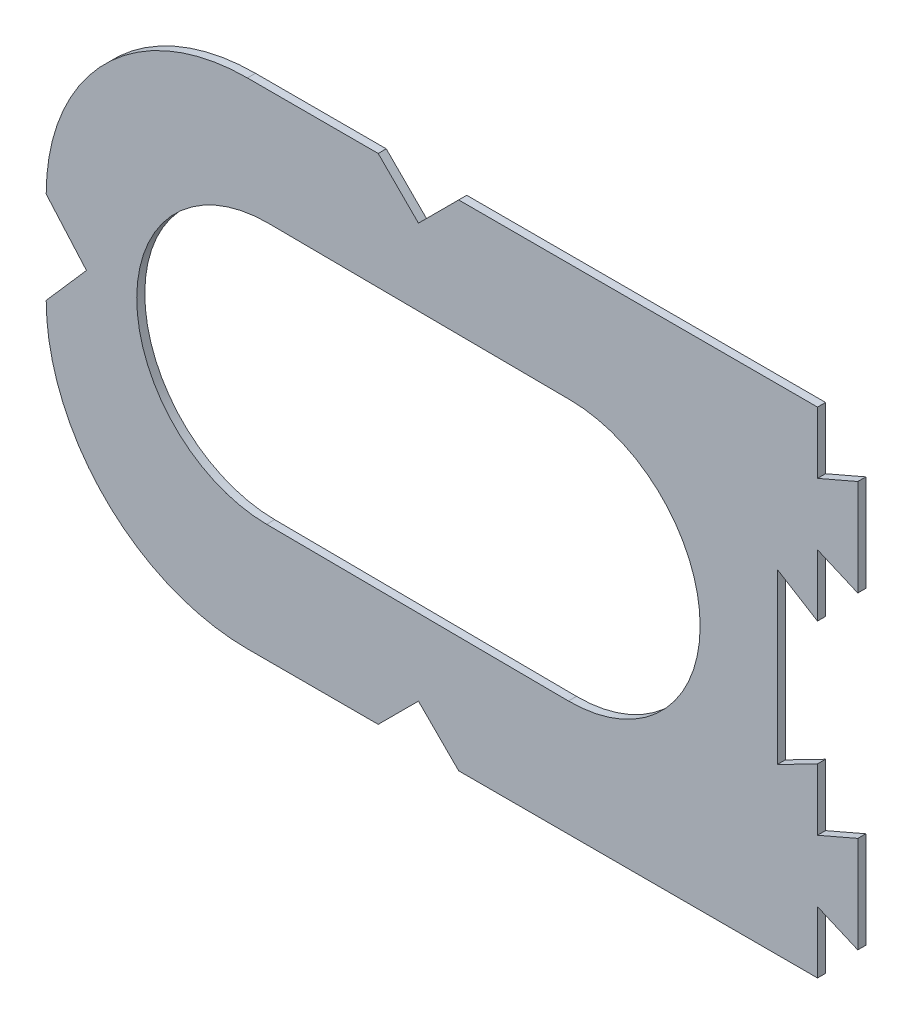
ISO-10303-21;
HEADER;
FILE_DESCRIPTION(('STEP AP214'),'2;1');
FILE_NAME('part.step','',(''),(''),'','','');
FILE_SCHEMA(('AUTOMOTIVE_DESIGN { 1 0 10303 214 1 1 1 1 }'));
ENDSEC;
DATA;
#1=APPLICATION_CONTEXT('core data for automotive mechanical design processes');
#2=APPLICATION_PROTOCOL_DEFINITION('international standard','automotive_design',2000,#1);
#3=PRODUCT_CONTEXT('',#1,'mechanical');
#4=PRODUCT('Part','Part','',(#3));
#5=PRODUCT_RELATED_PRODUCT_CATEGORY('part','',(#4));
#6=PRODUCT_DEFINITION_FORMATION('','',#4);
#7=PRODUCT_DEFINITION_CONTEXT('part definition',#1,'design');
#8=PRODUCT_DEFINITION('design','',#6,#7);
#9=PRODUCT_DEFINITION_SHAPE('','',#8);
#10=(LENGTH_UNIT() NAMED_UNIT(*) SI_UNIT(.MILLI.,.METRE.));
#11=(NAMED_UNIT(*) PLANE_ANGLE_UNIT() SI_UNIT($,.RADIAN.));
#12=(NAMED_UNIT(*) SI_UNIT($,.STERADIAN.) SOLID_ANGLE_UNIT());
#13=UNCERTAINTY_MEASURE_WITH_UNIT(LENGTH_MEASURE(1.E-05),#10,'distance_accuracy_value','');
#14=(GEOMETRIC_REPRESENTATION_CONTEXT(3) GLOBAL_UNCERTAINTY_ASSIGNED_CONTEXT((#13)) GLOBAL_UNIT_ASSIGNED_CONTEXT((#10,
#11,#12)) REPRESENTATION_CONTEXT('',''));
#15=CARTESIAN_POINT('',(0.,0.,0.));
#16=DIRECTION('',(0.,0.,1.));
#17=DIRECTION('',(1.,0.,0.));
#18=AXIS2_PLACEMENT_3D('',#15,#16,#17);
#19=CARTESIAN_POINT('',(0.,61.4294618882521,2.));
#20=DIRECTION('',(0.,-1.,0.));
#21=DIRECTION('',(1.,0.,0.));
#22=AXIS2_PLACEMENT_3D('',#19,#20,#21);
#23=PLANE('',#22);
#24=DIRECTION('',(-1.,0.,0.));
#25=VECTOR('',#24,1.);
#26=CARTESIAN_POINT('',(0.,61.4294618882521,0.));
#27=LINE('',#26,#25);
#28=CARTESIAN_POINT('',(-10.0000000000001,61.4294618882521,0.));
#29=VERTEX_POINT('',#28);
#30=CARTESIAN_POINT('',(-42.4977984899537,61.4294618882521,0.));
#31=VERTEX_POINT('',#30);
#32=EDGE_CURVE('E277',#29,#31,#27,.T.);
#33=ORIENTED_EDGE('',*,*,#32,.T.);
#34=DIRECTION('',(0.,0.,-1.));
#35=VECTOR('',#34,1.);
#36=CARTESIAN_POINT('',(-42.4977984899537,61.4294618882521,2.));
#37=LINE('',#36,#35);
#38=CARTESIAN_POINT('',(-42.4977984899537,61.4294618882521,2.));
#39=VERTEX_POINT('',#38);
#40=EDGE_CURVE('E11',#39,#31,#37,.T.);
#41=ORIENTED_EDGE('',*,*,#40,.F.);
#42=DIRECTION('',(-1.,0.,0.));
#43=VECTOR('',#42,1.);
#44=CARTESIAN_POINT('',(0.,61.4294618882521,2.));
#45=LINE('',#44,#43);
#46=CARTESIAN_POINT('',(-10.0000000000001,61.4294618882521,2.));
#47=VERTEX_POINT('',#46);
#48=EDGE_CURVE('E417',#47,#39,#45,.T.);
#49=ORIENTED_EDGE('',*,*,#48,.F.);
#50=DIRECTION('',(0.,0.,-1.));
#51=VECTOR('',#50,1.);
#52=CARTESIAN_POINT('',(-10.0000000000001,61.4294618882521,2.));
#53=LINE('',#52,#51);
#54=EDGE_CURVE('E344',#47,#29,#53,.T.);
#55=ORIENTED_EDGE('',*,*,#54,.T.);
#56=EDGE_LOOP('',(#33,#41,#49,#55));
#57=FACE_BOUND('',#56,.T.);
#58=ADVANCED_FACE('F41',(#57),#23,.F.);
#59=CARTESIAN_POINT('',(-42.4977984899541,11.4294618882521,2.));
#60=DIRECTION('',(0.,0.,-1.));
#61=DIRECTION('',(-1.,0.,0.));
#62=AXIS2_PLACEMENT_3D('',#59,#60,#61);
#63=CYLINDRICAL_SURFACE('',#62,50.);
#64=CARTESIAN_POINT('',(-42.4977984899541,11.4294618882521,0.));
#65=DIRECTION('',(0.,0.,1.));
#66=DIRECTION('',(1.,0.,0.));
#67=AXIS2_PLACEMENT_3D('',#64,#65,#66);
#68=CIRCLE('',#67,50.);
#69=CARTESIAN_POINT('',(-92.4977984899541,11.4294618882518,0.));
#70=VERTEX_POINT('',#69);
#71=EDGE_CURVE('E282',#31,#70,#68,.T.);
#72=ORIENTED_EDGE('',*,*,#71,.T.);
#73=DIRECTION('',(0.,0.,-1.));
#74=VECTOR('',#73,1.);
#75=CARTESIAN_POINT('',(-92.4977984899541,11.4294618882518,2.));
#76=LINE('',#75,#74);
#77=CARTESIAN_POINT('',(-92.4977984899541,11.4294618882518,2.));
#78=VERTEX_POINT('',#77);
#79=EDGE_CURVE('E51',#78,#70,#76,.T.);
#80=ORIENTED_EDGE('',*,*,#79,.F.);
#81=CARTESIAN_POINT('',(-42.4977984899541,11.4294618882521,2.));
#82=DIRECTION('',(0.,0.,1.));
#83=DIRECTION('',(1.,0.,0.));
#84=AXIS2_PLACEMENT_3D('',#81,#82,#83);
#85=CIRCLE('',#84,50.);
#86=EDGE_CURVE('E424',#39,#78,#85,.T.);
#87=ORIENTED_EDGE('',*,*,#86,.F.);
#88=ORIENTED_EDGE('',*,*,#40,.T.);
#89=EDGE_LOOP('',(#72,#80,#87,#88));
#90=FACE_BOUND('',#89,.T.);
#91=ADVANCED_FACE('F500',(#90),#63,.T.);
#92=CARTESIAN_POINT('',(-46.7275739735661,-40.8834417844265,2.));
#93=DIRECTION('',(-0.752602119765757,-0.658475549526396,0.));
#94=DIRECTION('',(0.658475549526396,-0.752602119765757,0.));
#95=AXIS2_PLACEMENT_3D('',#92,#93,#94);
#96=PLANE('',#95);
#97=DIRECTION('',(-0.658475549526396,0.752602119765757,0.));
#98=VECTOR('',#97,1.);
#99=CARTESIAN_POINT('',(-46.7275739735661,-40.8834417844265,0.));
#100=LINE('',#99,#98);
#101=CARTESIAN_POINT('',(-82.4977984899541,0.,0.));
#102=VERTEX_POINT('',#101);
#103=EDGE_CURVE('E281',#102,#70,#100,.T.);
#104=ORIENTED_EDGE('',*,*,#103,.F.);
#105=DIRECTION('',(0.,0.,-1.));
#106=VECTOR('',#105,1.);
#107=CARTESIAN_POINT('',(-82.4977984899541,0.,2.));
#108=LINE('',#107,#106);
#109=CARTESIAN_POINT('',(-82.4977984899541,0.,2.));
#110=VERTEX_POINT('',#109);
#111=EDGE_CURVE('E389',#110,#102,#108,.T.);
#112=ORIENTED_EDGE('',*,*,#111,.F.);
#113=DIRECTION('',(-0.658475549526396,0.752602119765757,0.));
#114=VECTOR('',#113,1.);
#115=CARTESIAN_POINT('',(-46.7275739735661,-40.8834417844265,2.));
#116=LINE('',#115,#114);
#117=EDGE_CURVE('E425',#110,#78,#116,.T.);
#118=ORIENTED_EDGE('',*,*,#117,.T.);
#119=ORIENTED_EDGE('',*,*,#79,.T.);
#120=EDGE_LOOP('',(#104,#112,#118,#119));
#121=FACE_BOUND('',#120,.T.);
#122=ADVANCED_FACE('F502',(#121),#96,.T.);
#123=CARTESIAN_POINT('',(-46.7275739735661,40.8834417844265,2.));
#124=DIRECTION('',(-0.752602119765757,0.658475549526396,0.));
#125=DIRECTION('',(-0.658475549526396,-0.752602119765757,0.));
#126=AXIS2_PLACEMENT_3D('',#123,#124,#125);
#127=PLANE('',#126);
#128=DIRECTION('',(0.658475549526396,0.752602119765757,0.));
#129=VECTOR('',#128,1.);
#130=CARTESIAN_POINT('',(-46.7275739735661,40.8834417844265,0.));
#131=LINE('',#130,#129);
#132=CARTESIAN_POINT('',(-92.4977984899541,-11.4294618882517,0.));
#133=VERTEX_POINT('',#132);
#134=EDGE_CURVE('E287',#133,#102,#131,.T.);
#135=ORIENTED_EDGE('',*,*,#134,.F.);
#136=DIRECTION('',(0.,0.,-1.));
#137=VECTOR('',#136,1.);
#138=CARTESIAN_POINT('',(-92.4977984899541,-11.4294618882517,2.));
#139=LINE('',#138,#137);
#140=CARTESIAN_POINT('',(-92.4977984899541,-11.4294618882517,2.));
#141=VERTEX_POINT('',#140);
#142=EDGE_CURVE('E386',#141,#133,#139,.T.);
#143=ORIENTED_EDGE('',*,*,#142,.F.);
#144=DIRECTION('',(0.658475549526396,0.752602119765757,0.));
#145=VECTOR('',#144,1.);
#146=CARTESIAN_POINT('',(-46.7275739735661,40.8834417844265,2.));
#147=LINE('',#146,#145);
#148=EDGE_CURVE('E426',#141,#110,#147,.T.);
#149=ORIENTED_EDGE('',*,*,#148,.T.);
#150=ORIENTED_EDGE('',*,*,#111,.T.);
#151=EDGE_LOOP('',(#135,#143,#149,#150));
#152=FACE_BOUND('',#151,.T.);
#153=ADVANCED_FACE('F591',(#152),#127,.T.);
#154=CARTESIAN_POINT('',(-42.4977984899541,-11.4294618882521,2.));
#155=DIRECTION('',(0.,0.,-1.));
#156=DIRECTION('',(-1.,0.,0.));
#157=AXIS2_PLACEMENT_3D('',#154,#155,#156);
#158=CYLINDRICAL_SURFACE('',#157,50.);
#159=CARTESIAN_POINT('',(-42.4977984899541,-11.4294618882521,0.));
#160=DIRECTION('',(0.,0.,1.));
#161=DIRECTION('',(1.,0.,0.));
#162=AXIS2_PLACEMENT_3D('',#159,#160,#161);
#163=CIRCLE('',#162,50.);
#164=CARTESIAN_POINT('',(-42.4977984899537,-61.4294618882521,0.));
#165=VERTEX_POINT('',#164);
#166=EDGE_CURVE('E290',#133,#165,#163,.T.);
#167=ORIENTED_EDGE('',*,*,#166,.T.);
#168=DIRECTION('',(0.,0.,-1.));
#169=VECTOR('',#168,1.);
#170=CARTESIAN_POINT('',(-42.4977984899537,-61.4294618882521,2.));
#171=LINE('',#170,#169);
#172=CARTESIAN_POINT('',(-42.4977984899537,-61.4294618882521,2.));
#173=VERTEX_POINT('',#172);
#174=EDGE_CURVE('E384',#173,#165,#171,.T.);
#175=ORIENTED_EDGE('',*,*,#174,.F.);
#176=CARTESIAN_POINT('',(-42.4977984899541,-11.4294618882521,2.));
#177=DIRECTION('',(0.,0.,1.));
#178=DIRECTION('',(1.,0.,0.));
#179=AXIS2_PLACEMENT_3D('',#176,#177,#178);
#180=CIRCLE('',#179,50.);
#181=EDGE_CURVE('E431',#141,#173,#180,.T.);
#182=ORIENTED_EDGE('',*,*,#181,.F.);
#183=ORIENTED_EDGE('',*,*,#142,.T.);
#184=EDGE_LOOP('',(#167,#175,#182,#183));
#185=FACE_BOUND('',#184,.T.);
#186=ADVANCED_FACE('F590',(#185),#158,.T.);
#187=CARTESIAN_POINT('',(0.,-61.4294618882521,2.));
#188=DIRECTION('',(0.,-1.,0.));
#189=DIRECTION('',(0.,0.,-1.));
#190=AXIS2_PLACEMENT_3D('',#187,#188,#189);
#191=PLANE('',#190);
#192=DIRECTION('',(-1.,0.,0.));
#193=VECTOR('',#192,1.);
#194=CARTESIAN_POINT('',(0.,-61.4294618882521,0.));
#195=LINE('',#194,#193);
#196=CARTESIAN_POINT('',(-9.99999999999979,-61.4294618882521,0.));
#197=VERTEX_POINT('',#196);
#198=EDGE_CURVE('E291',#197,#165,#195,.T.);
#199=ORIENTED_EDGE('',*,*,#198,.F.);
#200=DIRECTION('',(0.,0.,-1.));
#201=VECTOR('',#200,1.);
#202=CARTESIAN_POINT('',(-9.99999999999979,-61.4294618882521,2.));
#203=LINE('',#202,#201);
#204=CARTESIAN_POINT('',(-9.99999999999979,-61.4294618882521,2.));
#205=VERTEX_POINT('',#204);
#206=EDGE_CURVE('E385',#205,#197,#203,.T.);
#207=ORIENTED_EDGE('',*,*,#206,.F.);
#208=DIRECTION('',(-1.,0.,0.));
#209=VECTOR('',#208,1.);
#210=CARTESIAN_POINT('',(0.,-61.4294618882521,2.));
#211=LINE('',#210,#209);
#212=EDGE_CURVE('E434',#205,#173,#211,.T.);
#213=ORIENTED_EDGE('',*,*,#212,.T.);
#214=ORIENTED_EDGE('',*,*,#174,.T.);
#215=EDGE_LOOP('',(#199,#207,#213,#214));
#216=FACE_BOUND('',#215,.T.);
#217=ADVANCED_FACE('F583',(#216),#191,.T.);
#218=CARTESIAN_POINT('',(25.714730944126,-25.7147309441254,2.));
#219=DIRECTION('',(0.707106781186557,-0.707106781186539,0.));
#220=DIRECTION('',(0.707106781186539,0.707106781186557,0.));
#221=AXIS2_PLACEMENT_3D('',#218,#219,#220);
#222=PLANE('',#221);
#223=DIRECTION('',(-0.707106781186539,-0.707106781186556,0.));
#224=VECTOR('',#223,1.);
#225=CARTESIAN_POINT('',(25.714730944126,-25.7147309441254,0.));
#226=LINE('',#225,#224);
#227=CARTESIAN_POINT('',(0.,-51.4294618882521,0.));
#228=VERTEX_POINT('',#227);
#229=EDGE_CURVE('E296',#228,#197,#226,.T.);
#230=ORIENTED_EDGE('',*,*,#229,.F.);
#231=DIRECTION('',(0.,0.,-1.));
#232=VECTOR('',#231,1.);
#233=CARTESIAN_POINT('',(0.,-51.4294618882521,2.));
#234=LINE('',#233,#232);
#235=CARTESIAN_POINT('',(0.,-51.4294618882521,2.));
#236=VERTEX_POINT('',#235);
#237=EDGE_CURVE('E380',#236,#228,#234,.T.);
#238=ORIENTED_EDGE('',*,*,#237,.F.);
#239=DIRECTION('',(-0.707106781186539,-0.707106781186556,0.));
#240=VECTOR('',#239,1.);
#241=CARTESIAN_POINT('',(25.714730944126,-25.7147309441254,2.));
#242=LINE('',#241,#240);
#243=EDGE_CURVE('E438',#236,#205,#242,.T.);
#244=ORIENTED_EDGE('',*,*,#243,.T.);
#245=ORIENTED_EDGE('',*,*,#206,.T.);
#246=EDGE_LOOP('',(#230,#238,#244,#245));
#247=FACE_BOUND('',#246,.T.);
#248=ADVANCED_FACE('F579',(#247),#222,.T.);
#249=CARTESIAN_POINT('',(-25.7147309441261,-25.7147309441267,2.));
#250=DIRECTION('',(0.707106781186538,0.707106781186557,0.));
#251=DIRECTION('',(-0.707106781186557,0.707106781186538,0.));
#252=AXIS2_PLACEMENT_3D('',#249,#250,#251);
#253=PLANE('',#252);
#254=DIRECTION('',(0.707106781186557,-0.707106781186538,0.));
#255=VECTOR('',#254,1.);
#256=CARTESIAN_POINT('',(-25.7147309441261,-25.7147309441267,0.));
#257=LINE('',#256,#255);
#258=CARTESIAN_POINT('',(10.0000000000002,-61.4294618882521,0.));
#259=VERTEX_POINT('',#258);
#260=EDGE_CURVE('E298',#228,#259,#257,.T.);
#261=ORIENTED_EDGE('',*,*,#260,.T.);
#262=DIRECTION('',(0.,0.,-1.));
#263=VECTOR('',#262,1.);
#264=CARTESIAN_POINT('',(10.0000000000002,-61.4294618882521,2.));
#265=LINE('',#264,#263);
#266=CARTESIAN_POINT('',(10.0000000000002,-61.4294618882521,2.));
#267=VERTEX_POINT('',#266);
#268=EDGE_CURVE('E379',#267,#259,#265,.T.);
#269=ORIENTED_EDGE('',*,*,#268,.F.);
#270=DIRECTION('',(0.707106781186557,-0.707106781186538,0.));
#271=VECTOR('',#270,1.);
#272=CARTESIAN_POINT('',(-25.7147309441261,-25.7147309441267,2.));
#273=LINE('',#272,#271);
#274=EDGE_CURVE('E440',#236,#267,#273,.T.);
#275=ORIENTED_EDGE('',*,*,#274,.F.);
#276=ORIENTED_EDGE('',*,*,#237,.T.);
#277=EDGE_LOOP('',(#261,#269,#275,#276));
#278=FACE_BOUND('',#277,.T.);
#279=ADVANCED_FACE('F574',(#278),#253,.F.);
#280=CARTESIAN_POINT('',(0.,-61.4294618882521,2.));
#281=DIRECTION('',(0.,-1.,0.));
#282=DIRECTION('',(0.,0.,-1.));
#283=AXIS2_PLACEMENT_3D('',#280,#281,#282);
#284=PLANE('',#283);
#285=DIRECTION('',(-1.,0.,0.));
#286=VECTOR('',#285,1.);
#287=CARTESIAN_POINT('',(0.,-61.4294618882521,0.));
#288=LINE('',#287,#286);
#289=CARTESIAN_POINT('',(99.1612144125211,-61.4294618882521,0.));
#290=VERTEX_POINT('',#289);
#291=EDGE_CURVE('E302',#290,#259,#288,.T.);
#292=ORIENTED_EDGE('',*,*,#291,.F.);
#293=DIRECTION('',(0.,0.,-1.));
#294=VECTOR('',#293,1.);
#295=CARTESIAN_POINT('',(99.1612144125211,-61.4294618882521,2.));
#296=LINE('',#295,#294);
#297=CARTESIAN_POINT('',(99.1612144125211,-61.4294618882521,2.));
#298=VERTEX_POINT('',#297);
#299=EDGE_CURVE('E376',#298,#290,#296,.T.);
#300=ORIENTED_EDGE('',*,*,#299,.F.);
#301=DIRECTION('',(-1.,0.,0.));
#302=VECTOR('',#301,1.);
#303=CARTESIAN_POINT('',(0.,-61.4294618882521,2.));
#304=LINE('',#303,#302);
#305=EDGE_CURVE('E443',#298,#267,#304,.T.);
#306=ORIENTED_EDGE('',*,*,#305,.T.);
#307=ORIENTED_EDGE('',*,*,#268,.T.);
#308=EDGE_LOOP('',(#292,#300,#306,#307));
#309=FACE_BOUND('',#308,.T.);
#310=ADVANCED_FACE('F573',(#309),#284,.T.);
#311=CARTESIAN_POINT('',(99.1612144125209,3.5836934697452E-13,2.));
#312=DIRECTION('',(-1.,0.,0.));
#313=DIRECTION('',(0.,-1.,0.));
#314=AXIS2_PLACEMENT_3D('',#311,#312,#313);
#315=PLANE('',#314);
#316=DIRECTION('',(0.,1.,0.));
#317=VECTOR('',#316,1.);
#318=CARTESIAN_POINT('',(99.1612144125209,3.5836934697452E-13,0.));
#319=LINE('',#318,#317);
#320=CARTESIAN_POINT('',(99.1612144125211,-46.0694618882521,0.));
#321=VERTEX_POINT('',#320);
#322=EDGE_CURVE('E304',#290,#321,#319,.T.);
#323=ORIENTED_EDGE('',*,*,#322,.T.);
#324=DIRECTION('',(0.,0.,-1.));
#325=VECTOR('',#324,1.);
#326=CARTESIAN_POINT('',(99.1612144125211,-46.0694618882521,2.));
#327=LINE('',#326,#325);
#328=CARTESIAN_POINT('',(99.1612144125211,-46.0694618882521,2.));
#329=VERTEX_POINT('',#328);
#330=EDGE_CURVE('E374',#329,#321,#327,.T.);
#331=ORIENTED_EDGE('',*,*,#330,.F.);
#332=DIRECTION('',(0.,1.,0.));
#333=VECTOR('',#332,1.);
#334=CARTESIAN_POINT('',(99.1612144125209,3.5836934697452E-13,2.));
#335=LINE('',#334,#333);
#336=EDGE_CURVE('E444',#298,#329,#335,.T.);
#337=ORIENTED_EDGE('',*,*,#336,.F.);
#338=ORIENTED_EDGE('',*,*,#299,.T.);
#339=EDGE_LOOP('',(#323,#331,#337,#338));
#340=FACE_BOUND('',#339,.T.);
#341=ADVANCED_FACE('F567',(#340),#315,.F.);
#342=CARTESIAN_POINT('',(-1.17656903720344,-2.7235394379709,2.));
#343=DIRECTION('',(0.396576689295303,0.918001595590975,0.));
#344=DIRECTION('',(-0.918001595590975,0.396576689295303,0.));
#345=AXIS2_PLACEMENT_3D('',#342,#343,#344);
#346=PLANE('',#345);
#347=DIRECTION('',(0.918001595590975,-0.396576689295303,0.));
#348=VECTOR('',#347,1.);
#349=CARTESIAN_POINT('',(-1.17656903720344,-2.7235394379709,0.));
#350=LINE('',#349,#348);
#351=CARTESIAN_POINT('',(109.161214412521,-50.3894618882521,0.));
#352=VERTEX_POINT('',#351);
#353=EDGE_CURVE('E310',#321,#352,#350,.T.);
#354=ORIENTED_EDGE('',*,*,#353,.T.);
#355=DIRECTION('',(0.,0.,-1.));
#356=VECTOR('',#355,1.);
#357=CARTESIAN_POINT('',(109.161214412521,-50.3894618882521,2.));
#358=LINE('',#357,#356);
#359=CARTESIAN_POINT('',(109.161214412521,-50.3894618882521,2.));
#360=VERTEX_POINT('',#359);
#361=EDGE_CURVE('E372',#360,#352,#358,.T.);
#362=ORIENTED_EDGE('',*,*,#361,.F.);
#363=DIRECTION('',(0.918001595590975,-0.396576689295303,0.));
#364=VECTOR('',#363,1.);
#365=CARTESIAN_POINT('',(-1.17656903720344,-2.7235394379709,2.));
#366=LINE('',#365,#364);
#367=EDGE_CURVE('E446',#329,#360,#366,.T.);
#368=ORIENTED_EDGE('',*,*,#367,.F.);
#369=ORIENTED_EDGE('',*,*,#330,.T.);
#370=EDGE_LOOP('',(#354,#362,#368,#369));
#371=FACE_BOUND('',#370,.T.);
#372=ADVANCED_FACE('F561',(#371),#346,.F.);
#373=CARTESIAN_POINT('',(109.161214412521,0.,2.));
#374=DIRECTION('',(1.,0.,0.));
#375=DIRECTION('',(0.,1.,0.));
#376=AXIS2_PLACEMENT_3D('',#373,#374,#375);
#377=PLANE('',#376);
#378=DIRECTION('',(0.,-1.,0.));
#379=VECTOR('',#378,1.);
#380=CARTESIAN_POINT('',(109.161214412521,0.,0.));
#381=LINE('',#380,#379);
#382=CARTESIAN_POINT('',(109.161214412521,-26.3894618882521,0.));
#383=VERTEX_POINT('',#382);
#384=EDGE_CURVE('E307',#383,#352,#381,.T.);
#385=ORIENTED_EDGE('',*,*,#384,.F.);
#386=DIRECTION('',(0.,0.,-1.));
#387=VECTOR('',#386,1.);
#388=CARTESIAN_POINT('',(109.161214412521,-26.3894618882521,2.));
#389=LINE('',#388,#387);
#390=CARTESIAN_POINT('',(109.161214412521,-26.3894618882521,2.));
#391=VERTEX_POINT('',#390);
#392=EDGE_CURVE('E368',#391,#383,#389,.T.);
#393=ORIENTED_EDGE('',*,*,#392,.F.);
#394=DIRECTION('',(0.,-1.,0.));
#395=VECTOR('',#394,1.);
#396=CARTESIAN_POINT('',(109.161214412521,0.,2.));
#397=LINE('',#396,#395);
#398=EDGE_CURVE('E448',#391,#360,#397,.T.);
#399=ORIENTED_EDGE('',*,*,#398,.T.);
#400=ORIENTED_EDGE('',*,*,#361,.T.);
#401=EDGE_LOOP('',(#385,#393,#399,#400));
#402=FACE_BOUND('',#401,.T.);
#403=ADVANCED_FACE('F558',(#402),#377,.T.);
#404=CARTESIAN_POINT('',(26.7754149707466,-61.9801272470986,2.));
#405=DIRECTION('',(0.396576689295302,-0.918001595590976,0.));
#406=DIRECTION('',(0.918001595590976,0.396576689295302,0.));
#407=AXIS2_PLACEMENT_3D('',#404,#405,#406);
#408=PLANE('',#407);
#409=DIRECTION('',(-0.918001595590976,-0.396576689295302,0.));
#410=VECTOR('',#409,1.);
#411=CARTESIAN_POINT('',(26.7754149707466,-61.9801272470986,0.));
#412=LINE('',#411,#410);
#413=CARTESIAN_POINT('',(99.161214412521,-30.7094618882521,0.));
#414=VERTEX_POINT('',#413);
#415=EDGE_CURVE('E313',#383,#414,#412,.T.);
#416=ORIENTED_EDGE('',*,*,#415,.T.);
#417=DIRECTION('',(0.,0.,-1.));
#418=VECTOR('',#417,1.);
#419=CARTESIAN_POINT('',(99.161214412521,-30.7094618882521,2.));
#420=LINE('',#419,#418);
#421=CARTESIAN_POINT('',(99.161214412521,-30.7094618882521,2.));
#422=VERTEX_POINT('',#421);
#423=EDGE_CURVE('E366',#422,#414,#420,.T.);
#424=ORIENTED_EDGE('',*,*,#423,.F.);
#425=DIRECTION('',(-0.918001595590976,-0.396576689295302,0.));
#426=VECTOR('',#425,1.);
#427=CARTESIAN_POINT('',(26.7754149707466,-61.9801272470986,2.));
#428=LINE('',#427,#426);
#429=EDGE_CURVE('E451',#391,#422,#428,.T.);
#430=ORIENTED_EDGE('',*,*,#429,.F.);
#431=ORIENTED_EDGE('',*,*,#392,.T.);
#432=EDGE_LOOP('',(#416,#424,#430,#431));
#433=FACE_BOUND('',#432,.T.);
#434=ADVANCED_FACE('F553',(#433),#408,.F.);
#435=CARTESIAN_POINT('',(99.1612144125209,3.5836934697452E-13,2.));
#436=DIRECTION('',(-1.,0.,0.));
#437=DIRECTION('',(0.,-1.,0.));
#438=AXIS2_PLACEMENT_3D('',#435,#436,#437);
#439=PLANE('',#438);
#440=DIRECTION('',(0.,1.,0.));
#441=VECTOR('',#440,1.);
#442=CARTESIAN_POINT('',(99.1612144125209,3.5836934697452E-13,0.));
#443=LINE('',#442,#441);
#444=CARTESIAN_POINT('',(99.161214412521,-15.3494618882521,0.));
#445=VERTEX_POINT('',#444);
#446=EDGE_CURVE('E314',#414,#445,#443,.T.);
#447=ORIENTED_EDGE('',*,*,#446,.T.);
#448=DIRECTION('',(0.,0.,-1.));
#449=VECTOR('',#448,1.);
#450=CARTESIAN_POINT('',(99.161214412521,-15.3494618882521,2.));
#451=LINE('',#450,#449);
#452=CARTESIAN_POINT('',(99.161214412521,-15.3494618882521,2.));
#453=VERTEX_POINT('',#452);
#454=EDGE_CURVE('E362',#453,#445,#451,.T.);
#455=ORIENTED_EDGE('',*,*,#454,.F.);
#456=DIRECTION('',(0.,1.,0.));
#457=VECTOR('',#456,1.);
#458=CARTESIAN_POINT('',(99.1612144125209,3.5836934697452E-13,2.));
#459=LINE('',#458,#457);
#460=EDGE_CURVE('E453',#422,#453,#459,.T.);
#461=ORIENTED_EDGE('',*,*,#460,.F.);
#462=ORIENTED_EDGE('',*,*,#423,.T.);
#463=EDGE_LOOP('',(#447,#455,#461,#462));
#464=FACE_BOUND('',#463,.T.);
#465=ADVANCED_FACE('F552',(#464),#439,.F.);
#466=CARTESIAN_POINT('',(26.9638723848919,-52.4588956904525,2.));
#467=DIRECTION('',(-0.457147041036414,0.88939113042106,0.));
#468=DIRECTION('',(-0.88939113042106,-0.457147041036414,0.));
#469=AXIS2_PLACEMENT_3D('',#466,#467,#468);
#470=PLANE('',#469);
#471=DIRECTION('',(0.88939113042106,0.457147041036414,0.));
#472=VECTOR('',#471,1.);
#473=CARTESIAN_POINT('',(26.9638723848919,-52.4588956904525,0.));
#474=LINE('',#473,#472);
#475=CARTESIAN_POINT('',(89.161214412521,-20.489461888252,0.));
#476=VERTEX_POINT('',#475);
#477=EDGE_CURVE('E318',#476,#445,#474,.T.);
#478=ORIENTED_EDGE('',*,*,#477,.F.);
#479=DIRECTION('',(0.,0.,-1.));
#480=VECTOR('',#479,1.);
#481=CARTESIAN_POINT('',(89.161214412521,-20.489461888252,2.));
#482=LINE('',#481,#480);
#483=CARTESIAN_POINT('',(89.161214412521,-20.489461888252,2.));
#484=VERTEX_POINT('',#483);
#485=EDGE_CURVE('E365',#484,#476,#482,.T.);
#486=ORIENTED_EDGE('',*,*,#485,.F.);
#487=DIRECTION('',(0.88939113042106,0.457147041036414,0.));
#488=VECTOR('',#487,1.);
#489=CARTESIAN_POINT('',(26.9638723848919,-52.4588956904525,2.));
#490=LINE('',#489,#488);
#491=EDGE_CURVE('E454',#484,#453,#490,.T.);
#492=ORIENTED_EDGE('',*,*,#491,.T.);
#493=ORIENTED_EDGE('',*,*,#454,.T.);
#494=EDGE_LOOP('',(#478,#486,#492,#493));
#495=FACE_BOUND('',#494,.T.);
#496=ADVANCED_FACE('F550',(#495),#470,.T.);
#497=CARTESIAN_POINT('',(89.1612144125209,1.76765773472002E-13,2.));
#498=DIRECTION('',(1.,0.,0.));
#499=DIRECTION('',(0.,1.,0.));
#500=AXIS2_PLACEMENT_3D('',#497,#498,#499);
#501=PLANE('',#500);
#502=DIRECTION('',(0.,-1.,0.));
#503=VECTOR('',#502,1.);
#504=CARTESIAN_POINT('',(89.1612144125209,1.76765773472002E-13,0.));
#505=LINE('',#504,#503);
#506=CARTESIAN_POINT('',(89.1612144125209,21.5105381117479,0.));
#507=VERTEX_POINT('',#506);
#508=EDGE_CURVE('E321',#507,#476,#505,.T.);
#509=ORIENTED_EDGE('',*,*,#508,.F.);
#510=DIRECTION('',(0.,0.,-1.));
#511=VECTOR('',#510,1.);
#512=CARTESIAN_POINT('',(89.1612144125209,21.5105381117479,2.));
#513=LINE('',#512,#511);
#514=CARTESIAN_POINT('',(89.1612144125209,21.5105381117479,2.));
#515=VERTEX_POINT('',#514);
#516=EDGE_CURVE('E359',#515,#507,#513,.T.);
#517=ORIENTED_EDGE('',*,*,#516,.F.);
#518=DIRECTION('',(0.,-1.,0.));
#519=VECTOR('',#518,1.);
#520=CARTESIAN_POINT('',(89.1612144125209,1.76765773472002E-13,2.));
#521=LINE('',#520,#519);
#522=EDGE_CURVE('E457',#515,#484,#521,.T.);
#523=ORIENTED_EDGE('',*,*,#522,.T.);
#524=ORIENTED_EDGE('',*,*,#485,.T.);
#525=EDGE_LOOP('',(#509,#517,#523,#524));
#526=FACE_BOUND('',#525,.T.);
#527=ADVANCED_FACE('F543',(#526),#501,.T.);
#528=CARTESIAN_POINT('',(34.0021986914095,55.3781737645104,2.));
#529=DIRECTION('',(0.523241319031515,0.852184558683247,0.));
#530=DIRECTION('',(-0.852184558683247,0.523241319031515,0.));
#531=AXIS2_PLACEMENT_3D('',#528,#529,#530);
#532=PLANE('',#531);
#533=DIRECTION('',(0.852184558683247,-0.523241319031515,0.));
#534=VECTOR('',#533,1.);
#535=CARTESIAN_POINT('',(34.0021986914095,55.3781737645104,0.));
#536=LINE('',#535,#534);
#537=CARTESIAN_POINT('',(99.1612144125209,15.3705381117479,0.));
#538=VERTEX_POINT('',#537);
#539=EDGE_CURVE('E323',#507,#538,#536,.T.);
#540=ORIENTED_EDGE('',*,*,#539,.T.);
#541=DIRECTION('',(0.,0.,-1.));
#542=VECTOR('',#541,1.);
#543=CARTESIAN_POINT('',(99.1612144125209,15.3705381117479,2.));
#544=LINE('',#543,#542);
#545=CARTESIAN_POINT('',(99.1612144125209,15.3705381117479,2.));
#546=VERTEX_POINT('',#545);
#547=EDGE_CURVE('E360',#546,#538,#544,.T.);
#548=ORIENTED_EDGE('',*,*,#547,.F.);
#549=DIRECTION('',(0.852184558683247,-0.523241319031515,0.));
#550=VECTOR('',#549,1.);
#551=CARTESIAN_POINT('',(34.0021986914095,55.3781737645104,2.));
#552=LINE('',#551,#550);
#553=EDGE_CURVE('E462',#515,#546,#552,.T.);
#554=ORIENTED_EDGE('',*,*,#553,.F.);
#555=ORIENTED_EDGE('',*,*,#516,.T.);
#556=EDGE_LOOP('',(#540,#548,#554,#555));
#557=FACE_BOUND('',#556,.T.);
#558=ADVANCED_FACE('F537',(#557),#532,.F.);
#559=CARTESIAN_POINT('',(99.1612144125209,3.5836934697452E-13,2.));
#560=DIRECTION('',(-1.,0.,0.));
#561=DIRECTION('',(0.,-1.,0.));
#562=AXIS2_PLACEMENT_3D('',#559,#560,#561);
#563=PLANE('',#562);
#564=DIRECTION('',(0.,1.,0.));
#565=VECTOR('',#564,1.);
#566=CARTESIAN_POINT('',(99.1612144125209,3.5836934697452E-13,0.));
#567=LINE('',#566,#565);
#568=CARTESIAN_POINT('',(99.1612144125208,30.7305381117479,0.));
#569=VERTEX_POINT('',#568);
#570=EDGE_CURVE('E327',#538,#569,#567,.T.);
#571=ORIENTED_EDGE('',*,*,#570,.T.);
#572=DIRECTION('',(0.,0.,-1.));
#573=VECTOR('',#572,1.);
#574=CARTESIAN_POINT('',(99.1612144125208,30.7305381117479,2.));
#575=LINE('',#574,#573);
#576=CARTESIAN_POINT('',(99.1612144125208,30.7305381117479,2.));
#577=VERTEX_POINT('',#576);
#578=EDGE_CURVE('E354',#577,#569,#575,.T.);
#579=ORIENTED_EDGE('',*,*,#578,.F.);
#580=DIRECTION('',(0.,1.,0.));
#581=VECTOR('',#580,1.);
#582=CARTESIAN_POINT('',(99.1612144125209,3.5836934697452E-13,2.));
#583=LINE('',#582,#581);
#584=EDGE_CURVE('E464',#546,#577,#583,.T.);
#585=ORIENTED_EDGE('',*,*,#584,.F.);
#586=ORIENTED_EDGE('',*,*,#547,.T.);
#587=EDGE_LOOP('',(#571,#579,#585,#586));
#588=FACE_BOUND('',#587,.T.);
#589=ADVANCED_FACE('F532',(#588),#563,.F.);
#590=CARTESIAN_POINT('',(26.7830879392272,61.9978887482109,2.));
#591=DIRECTION('',(0.396576689295303,0.918001595590975,0.));
#592=DIRECTION('',(-0.918001595590975,0.396576689295303,0.));
#593=AXIS2_PLACEMENT_3D('',#590,#591,#592);
#594=PLANE('',#593);
#595=DIRECTION('',(0.918001595590975,-0.396576689295303,0.));
#596=VECTOR('',#595,1.);
#597=CARTESIAN_POINT('',(26.7830879392272,61.9978887482109,0.));
#598=LINE('',#597,#596);
#599=CARTESIAN_POINT('',(109.161214412521,26.4105381117479,0.));
#600=VERTEX_POINT('',#599);
#601=EDGE_CURVE('E329',#569,#600,#598,.T.);
#602=ORIENTED_EDGE('',*,*,#601,.T.);
#603=DIRECTION('',(0.,0.,-1.));
#604=VECTOR('',#603,1.);
#605=CARTESIAN_POINT('',(109.161214412521,26.4105381117479,2.));
#606=LINE('',#605,#604);
#607=CARTESIAN_POINT('',(109.161214412521,26.4105381117479,2.));
#608=VERTEX_POINT('',#607);
#609=EDGE_CURVE('E355',#608,#600,#606,.T.);
#610=ORIENTED_EDGE('',*,*,#609,.F.);
#611=DIRECTION('',(0.918001595590975,-0.396576689295303,0.));
#612=VECTOR('',#611,1.);
#613=CARTESIAN_POINT('',(26.7830879392272,61.9978887482109,2.));
#614=LINE('',#613,#612);
#615=EDGE_CURVE('E463',#577,#608,#614,.T.);
#616=ORIENTED_EDGE('',*,*,#615,.F.);
#617=ORIENTED_EDGE('',*,*,#578,.T.);
#618=EDGE_LOOP('',(#602,#610,#616,#617));
#619=FACE_BOUND('',#618,.T.);
#620=ADVANCED_FACE('F533',(#619),#594,.F.);
#621=CARTESIAN_POINT('',(109.161214412521,0.,2.));
#622=DIRECTION('',(1.,0.,0.));
#623=DIRECTION('',(0.,0.,-1.));
#624=AXIS2_PLACEMENT_3D('',#621,#622,#623);
#625=PLANE('',#624);
#626=DIRECTION('',(0.,-1.,0.));
#627=VECTOR('',#626,1.);
#628=CARTESIAN_POINT('',(109.161214412521,0.,0.));
#629=LINE('',#628,#627);
#630=CARTESIAN_POINT('',(109.161214412521,50.4105381117479,0.));
#631=VERTEX_POINT('',#630);
#632=EDGE_CURVE('E331',#631,#600,#629,.T.);
#633=ORIENTED_EDGE('',*,*,#632,.F.);
#634=DIRECTION('',(0.,0.,-1.));
#635=VECTOR('',#634,1.);
#636=CARTESIAN_POINT('',(109.161214412521,50.4105381117479,2.));
#637=LINE('',#636,#635);
#638=CARTESIAN_POINT('',(109.161214412521,50.4105381117479,2.));
#639=VERTEX_POINT('',#638);
#640=EDGE_CURVE('E349',#639,#631,#637,.T.);
#641=ORIENTED_EDGE('',*,*,#640,.F.);
#642=DIRECTION('',(0.,-1.,0.));
#643=VECTOR('',#642,1.);
#644=CARTESIAN_POINT('',(109.161214412521,0.,2.));
#645=LINE('',#644,#643);
#646=EDGE_CURVE('E467',#639,#608,#645,.T.);
#647=ORIENTED_EDGE('',*,*,#646,.T.);
#648=ORIENTED_EDGE('',*,*,#609,.T.);
#649=EDGE_LOOP('',(#633,#641,#647,#648));
#650=FACE_BOUND('',#649,.T.);
#651=ADVANCED_FACE('F526',(#650),#625,.T.);
#652=CARTESIAN_POINT('',(-1.18424200568401,2.74130093908336,2.));
#653=DIRECTION('',(0.396576689295302,-0.918001595590976,0.));
#654=DIRECTION('',(0.918001595590976,0.396576689295302,0.));
#655=AXIS2_PLACEMENT_3D('',#652,#653,#654);
#656=PLANE('',#655);
#657=DIRECTION('',(-0.918001595590976,-0.396576689295302,0.));
#658=VECTOR('',#657,1.);
#659=CARTESIAN_POINT('',(-1.18424200568401,2.74130093908336,0.));
#660=LINE('',#659,#658);
#661=CARTESIAN_POINT('',(99.1612144125208,46.0905381117479,0.));
#662=VERTEX_POINT('',#661);
#663=EDGE_CURVE('E333',#631,#662,#660,.T.);
#664=ORIENTED_EDGE('',*,*,#663,.T.);
#665=DIRECTION('',(0.,0.,-1.));
#666=VECTOR('',#665,1.);
#667=CARTESIAN_POINT('',(99.1612144125208,46.0905381117479,2.));
#668=LINE('',#667,#666);
#669=CARTESIAN_POINT('',(99.1612144125208,46.0905381117479,2.));
#670=VERTEX_POINT('',#669);
#671=EDGE_CURVE('E347',#670,#662,#668,.T.);
#672=ORIENTED_EDGE('',*,*,#671,.F.);
#673=DIRECTION('',(-0.918001595590976,-0.396576689295302,0.));
#674=VECTOR('',#673,1.);
#675=CARTESIAN_POINT('',(-1.18424200568401,2.74130093908336,2.));
#676=LINE('',#675,#674);
#677=EDGE_CURVE('E470',#639,#670,#676,.T.);
#678=ORIENTED_EDGE('',*,*,#677,.F.);
#679=ORIENTED_EDGE('',*,*,#640,.T.);
#680=EDGE_LOOP('',(#664,#672,#678,#679));
#681=FACE_BOUND('',#680,.T.);
#682=ADVANCED_FACE('F473',(#681),#656,.F.);
#683=CARTESIAN_POINT('',(99.1612144125209,3.5836934697452E-13,2.));
#684=DIRECTION('',(-1.,0.,0.));
#685=DIRECTION('',(0.,-1.,0.));
#686=AXIS2_PLACEMENT_3D('',#683,#684,#685);
#687=PLANE('',#686);
#688=DIRECTION('',(0.,1.,0.));
#689=VECTOR('',#688,1.);
#690=CARTESIAN_POINT('',(99.1612144125209,3.5836934697452E-13,0.));
#691=LINE('',#690,#689);
#692=CARTESIAN_POINT('',(99.1612144125207,61.4294618882521,0.));
#693=VERTEX_POINT('',#692);
#694=EDGE_CURVE('E337',#662,#693,#691,.T.);
#695=ORIENTED_EDGE('',*,*,#694,.T.);
#696=DIRECTION('',(0.,0.,-1.));
#697=VECTOR('',#696,1.);
#698=CARTESIAN_POINT('',(99.1612144125207,61.4294618882521,2.));
#699=LINE('',#698,#697);
#700=CARTESIAN_POINT('',(99.1612144125207,61.4294618882521,2.));
#701=VERTEX_POINT('',#700);
#702=EDGE_CURVE('E256',#701,#693,#699,.T.);
#703=ORIENTED_EDGE('',*,*,#702,.F.);
#704=DIRECTION('',(0.,1.,0.));
#705=VECTOR('',#704,1.);
#706=CARTESIAN_POINT('',(99.1612144125209,3.5836934697452E-13,2.));
#707=LINE('',#706,#705);
#708=EDGE_CURVE('E245',#670,#701,#707,.T.);
#709=ORIENTED_EDGE('',*,*,#708,.F.);
#710=ORIENTED_EDGE('',*,*,#671,.T.);
#711=EDGE_LOOP('',(#695,#703,#709,#710));
#712=FACE_BOUND('',#711,.T.);
#713=ADVANCED_FACE('F478',(#712),#687,.F.);
#714=CARTESIAN_POINT('',(0.,61.4294618882521,2.));
#715=DIRECTION('',(0.,-1.,0.));
#716=DIRECTION('',(1.,0.,0.));
#717=AXIS2_PLACEMENT_3D('',#714,#715,#716);
#718=PLANE('',#717);
#719=DIRECTION('',(-1.,0.,0.));
#720=VECTOR('',#719,1.);
#721=CARTESIAN_POINT('',(0.,61.4294618882521,0.));
#722=LINE('',#721,#720);
#723=CARTESIAN_POINT('',(9.99999999999998,61.4294618882521,0.));
#724=VERTEX_POINT('',#723);
#725=EDGE_CURVE('E253',#693,#724,#722,.T.);
#726=ORIENTED_EDGE('',*,*,#725,.T.);
#727=DIRECTION('',(0.,0.,-1.));
#728=VECTOR('',#727,1.);
#729=CARTESIAN_POINT('',(9.99999999999998,61.4294618882521,2.));
#730=LINE('',#729,#728);
#731=CARTESIAN_POINT('',(9.99999999999998,61.4294618882521,2.));
#732=VERTEX_POINT('',#731);
#733=EDGE_CURVE('E251',#732,#724,#730,.T.);
#734=ORIENTED_EDGE('',*,*,#733,.F.);
#735=DIRECTION('',(-1.,0.,0.));
#736=VECTOR('',#735,1.);
#737=CARTESIAN_POINT('',(0.,61.4294618882521,2.));
#738=LINE('',#737,#736);
#739=EDGE_CURVE('E236',#701,#732,#738,.T.);
#740=ORIENTED_EDGE('',*,*,#739,.F.);
#741=ORIENTED_EDGE('',*,*,#702,.T.);
#742=EDGE_LOOP('',(#726,#734,#740,#741));
#743=FACE_BOUND('',#742,.T.);
#744=ADVANCED_FACE('F252',(#743),#718,.F.);
#745=CARTESIAN_POINT('',(-25.714730944126,25.7147309441259,2.));
#746=DIRECTION('',(-0.707106781186549,0.707106781186546,0.));
#747=DIRECTION('',(-0.707106781186546,-0.707106781186549,0.));
#748=AXIS2_PLACEMENT_3D('',#745,#746,#747);
#749=PLANE('',#748);
#750=DIRECTION('',(0.707106781186546,0.707106781186549,0.));
#751=VECTOR('',#750,1.);
#752=CARTESIAN_POINT('',(-25.714730944126,25.7147309441259,0.));
#753=LINE('',#752,#751);
#754=CARTESIAN_POINT('',(0.,51.4294618882521,0.));
#755=VERTEX_POINT('',#754);
#756=EDGE_CURVE('E339',#755,#724,#753,.T.);
#757=ORIENTED_EDGE('',*,*,#756,.F.);
#758=DIRECTION('',(0.,0.,-1.));
#759=VECTOR('',#758,1.);
#760=CARTESIAN_POINT('',(0.,51.4294618882521,2.));
#761=LINE('',#760,#759);
#762=CARTESIAN_POINT('',(0.,51.4294618882521,2.));
#763=VERTEX_POINT('',#762);
#764=EDGE_CURVE('E151',#763,#755,#761,.T.);
#765=ORIENTED_EDGE('',*,*,#764,.F.);
#766=DIRECTION('',(0.707106781186546,0.707106781186549,0.));
#767=VECTOR('',#766,1.);
#768=CARTESIAN_POINT('',(-25.714730944126,25.7147309441259,2.));
#769=LINE('',#768,#767);
#770=EDGE_CURVE('E244',#763,#732,#769,.T.);
#771=ORIENTED_EDGE('',*,*,#770,.T.);
#772=ORIENTED_EDGE('',*,*,#733,.T.);
#773=EDGE_LOOP('',(#757,#765,#771,#772));
#774=FACE_BOUND('',#773,.T.);
#775=ADVANCED_FACE('F259',(#774),#749,.T.);
#776=CARTESIAN_POINT('',(37.4990736419769,-0.263582991860177,2.));
#777=DIRECTION('',(0.,0.,-1.));
#778=DIRECTION('',(-1.,0.,0.));
#779=AXIS2_PLACEMENT_3D('',#776,#777,#778);
#780=CYLINDRICAL_SURFACE('',#779,32.5);
#781=CARTESIAN_POINT('',(37.4990736419769,-0.263582991860177,0.));
#782=DIRECTION('',(0.,0.,1.));
#783=DIRECTION('',(1.,0.,0.));
#784=AXIS2_PLACEMENT_3D('',#781,#782,#783);
#785=CIRCLE('',#784,32.5);
#786=CARTESIAN_POINT('',(37.2706350490314,-32.7627801482401,0.));
#787=VERTEX_POINT('',#786);
#788=CARTESIAN_POINT('',(37.7275122349224,32.2356141645198,0.));
#789=VERTEX_POINT('',#788);
#790=EDGE_CURVE('E266',#787,#789,#785,.T.);
#791=ORIENTED_EDGE('',*,*,#790,.F.);
#792=DIRECTION('',(0.,0.,-1.));
#793=VECTOR('',#792,1.);
#794=CARTESIAN_POINT('',(37.2706350490314,-32.7627801482401,2.));
#795=LINE('',#794,#793);
#796=CARTESIAN_POINT('',(37.2706350490314,-32.7627801482401,2.));
#797=VERTEX_POINT('',#796);
#798=EDGE_CURVE('E44',#797,#787,#795,.T.);
#799=ORIENTED_EDGE('',*,*,#798,.F.);
#800=CARTESIAN_POINT('',(37.4990736419769,-0.263582991860177,2.));
#801=DIRECTION('',(0.,0.,1.));
#802=DIRECTION('',(1.,0.,0.));
#803=AXIS2_PLACEMENT_3D('',#800,#801,#802);
#804=CIRCLE('',#803,32.5);
#805=CARTESIAN_POINT('',(37.7275122349224,32.2356141645198,2.));
#806=VERTEX_POINT('',#805);
#807=EDGE_CURVE('E342',#797,#806,#804,.T.);
#808=ORIENTED_EDGE('',*,*,#807,.T.);
#809=DIRECTION('',(0.,0.,-1.));
#810=VECTOR('',#809,1.);
#811=CARTESIAN_POINT('',(37.7275122349224,32.2356141645198,2.));
#812=LINE('',#811,#810);
#813=EDGE_CURVE('E265',#806,#789,#812,.T.);
#814=ORIENTED_EDGE('',*,*,#813,.T.);
#815=EDGE_LOOP('',(#791,#799,#808,#814));
#816=FACE_BOUND('',#815,.T.);
#817=ADVANCED_FACE('F43',(#816),#780,.F.);
#818=CARTESIAN_POINT('',(-0.228438592945491,-32.4991971563799,2.));
#819=DIRECTION('',(0.00702887978293819,0.999975297119382,0.));
#820=DIRECTION('',(-0.999975297119382,0.00702887978293819,0.));
#821=AXIS2_PLACEMENT_3D('',#818,#819,#820);
#822=PLANE('',#821);
#823=DIRECTION('',(0.999975297119382,-0.00702887978293819,0.));
#824=VECTOR('',#823,1.);
#825=CARTESIAN_POINT('',(-0.228438592945491,-32.4991971563799,0.));
#826=LINE('',#825,#824);
#827=CARTESIAN_POINT('',(-37.7275122349224,-32.2356141645197,0.));
#828=VERTEX_POINT('',#827);
#829=EDGE_CURVE('E267',#828,#787,#826,.T.);
#830=ORIENTED_EDGE('',*,*,#829,.F.);
#831=DIRECTION('',(0.,0.,-1.));
#832=VECTOR('',#831,1.);
#833=CARTESIAN_POINT('',(-37.7275122349224,-32.2356141645197,2.));
#834=LINE('',#833,#832);
#835=CARTESIAN_POINT('',(-37.7275122349224,-32.2356141645197,2.));
#836=VERTEX_POINT('',#835);
#837=EDGE_CURVE('E391',#836,#828,#834,.T.);
#838=ORIENTED_EDGE('',*,*,#837,.F.);
#839=DIRECTION('',(0.999975297119382,-0.00702887978293819,0.));
#840=VECTOR('',#839,1.);
#841=CARTESIAN_POINT('',(-0.228438592945491,-32.4991971563799,2.));
#842=LINE('',#841,#840);
#843=EDGE_CURVE('E405',#836,#797,#842,.T.);
#844=ORIENTED_EDGE('',*,*,#843,.T.);
#845=ORIENTED_EDGE('',*,*,#798,.T.);
#846=EDGE_LOOP('',(#830,#838,#844,#845));
#847=FACE_BOUND('',#846,.T.);
#848=ADVANCED_FACE('F397',(#847),#822,.T.);
#849=CARTESIAN_POINT('',(-37.4990736419769,0.263582991860191,2.));
#850=DIRECTION('',(0.,0.,-1.));
#851=DIRECTION('',(-1.,0.,0.));
#852=AXIS2_PLACEMENT_3D('',#849,#850,#851);
#853=CYLINDRICAL_SURFACE('',#852,32.5);
#854=CARTESIAN_POINT('',(-37.4990736419769,0.263582991860191,0.));
#855=DIRECTION('',(0.,0.,1.));
#856=DIRECTION('',(1.,0.,0.));
#857=AXIS2_PLACEMENT_3D('',#854,#855,#856);
#858=CIRCLE('',#857,32.5);
#859=CARTESIAN_POINT('',(-37.2706350490314,32.7627801482401,0.));
#860=VERTEX_POINT('',#859);
#861=EDGE_CURVE('E275',#860,#828,#858,.T.);
#862=ORIENTED_EDGE('',*,*,#861,.F.);
#863=DIRECTION('',(0.,0.,-1.));
#864=VECTOR('',#863,1.);
#865=CARTESIAN_POINT('',(-37.2706350490314,32.7627801482401,2.));
#866=LINE('',#865,#864);
#867=CARTESIAN_POINT('',(-37.2706350490314,32.7627801482401,2.));
#868=VERTEX_POINT('',#867);
#869=EDGE_CURVE('E392',#868,#860,#866,.T.);
#870=ORIENTED_EDGE('',*,*,#869,.F.);
#871=CARTESIAN_POINT('',(-37.4990736419769,0.263582991860191,2.));
#872=DIRECTION('',(0.,0.,1.));
#873=DIRECTION('',(1.,0.,0.));
#874=AXIS2_PLACEMENT_3D('',#871,#872,#873);
#875=CIRCLE('',#874,32.5);
#876=EDGE_CURVE('E411',#868,#836,#875,.T.);
#877=ORIENTED_EDGE('',*,*,#876,.T.);
#878=ORIENTED_EDGE('',*,*,#837,.T.);
#879=EDGE_LOOP('',(#862,#870,#877,#878));
#880=FACE_BOUND('',#879,.T.);
#881=ADVANCED_FACE('F408',(#880),#853,.F.);
#882=CARTESIAN_POINT('',(0.228438592945491,32.4991971563799,2.));
#883=DIRECTION('',(0.0070288797829382,0.999975297119382,0.));
#884=DIRECTION('',(-0.999975297119382,0.0070288797829382,0.));
#885=AXIS2_PLACEMENT_3D('',#882,#883,#884);
#886=PLANE('',#885);
#887=DIRECTION('',(0.999975297119382,-0.0070288797829382,0.));
#888=VECTOR('',#887,1.);
#889=CARTESIAN_POINT('',(0.228438592945491,32.4991971563799,0.));
#890=LINE('',#889,#888);
#891=EDGE_CURVE('E274',#860,#789,#890,.T.);
#892=ORIENTED_EDGE('',*,*,#891,.T.);
#893=ORIENTED_EDGE('',*,*,#813,.F.);
#894=DIRECTION('',(0.999975297119382,-0.0070288797829382,0.));
#895=VECTOR('',#894,1.);
#896=CARTESIAN_POINT('',(0.228438592945491,32.4991971563799,2.));
#897=LINE('',#896,#895);
#898=EDGE_CURVE('E412',#868,#806,#897,.T.);
#899=ORIENTED_EDGE('',*,*,#898,.F.);
#900=ORIENTED_EDGE('',*,*,#869,.T.);
#901=EDGE_LOOP('',(#892,#893,#899,#900));
#902=FACE_BOUND('',#901,.T.);
#903=ADVANCED_FACE('F413',(#902),#886,.F.);
#904=CARTESIAN_POINT('',(25.7147309441261,25.7147309441263,2.));
#905=DIRECTION('',(-0.707106781186544,-0.707106781186551,0.));
#906=DIRECTION('',(0.707106781186551,-0.707106781186544,0.));
#907=AXIS2_PLACEMENT_3D('',#904,#905,#906);
#908=PLANE('',#907);
#909=DIRECTION('',(-0.707106781186551,0.707106781186544,0.));
#910=VECTOR('',#909,1.);
#911=CARTESIAN_POINT('',(25.7147309441261,25.7147309441263,0.));
#912=LINE('',#911,#910);
#913=EDGE_CURVE('E153',#755,#29,#912,.T.);
#914=ORIENTED_EDGE('',*,*,#913,.T.);
#915=ORIENTED_EDGE('',*,*,#54,.F.);
#916=DIRECTION('',(-0.707106781186551,0.707106781186544,0.));
#917=VECTOR('',#916,1.);
#918=CARTESIAN_POINT('',(25.7147309441261,25.7147309441263,2.));
#919=LINE('',#918,#917);
#920=EDGE_CURVE('E58',#763,#47,#919,.T.);
#921=ORIENTED_EDGE('',*,*,#920,.F.);
#922=ORIENTED_EDGE('',*,*,#764,.T.);
#923=EDGE_LOOP('',(#914,#915,#921,#922));
#924=FACE_BOUND('',#923,.T.);
#925=ADVANCED_FACE('F485',(#924),#908,.F.);
#926=CARTESIAN_POINT('',(0.,0.,2.));
#927=DIRECTION('',(0.,0.,1.));
#928=DIRECTION('',(1.,0.,0.));
#929=AXIS2_PLACEMENT_3D('',#926,#927,#928);
#930=PLANE('',#929);
#931=ORIENTED_EDGE('',*,*,#807,.F.);
#932=ORIENTED_EDGE('',*,*,#843,.F.);
#933=ORIENTED_EDGE('',*,*,#876,.F.);
#934=ORIENTED_EDGE('',*,*,#898,.T.);
#935=EDGE_LOOP('',(#931,#932,#933,#934));
#936=FACE_BOUND('',#935,.T.);
#937=ORIENTED_EDGE('',*,*,#48,.T.);
#938=ORIENTED_EDGE('',*,*,#86,.T.);
#939=ORIENTED_EDGE('',*,*,#117,.F.);
#940=ORIENTED_EDGE('',*,*,#148,.F.);
#941=ORIENTED_EDGE('',*,*,#181,.T.);
#942=ORIENTED_EDGE('',*,*,#212,.F.);
#943=ORIENTED_EDGE('',*,*,#243,.F.);
#944=ORIENTED_EDGE('',*,*,#274,.T.);
#945=ORIENTED_EDGE('',*,*,#305,.F.);
#946=ORIENTED_EDGE('',*,*,#336,.T.);
#947=ORIENTED_EDGE('',*,*,#367,.T.);
#948=ORIENTED_EDGE('',*,*,#398,.F.);
#949=ORIENTED_EDGE('',*,*,#429,.T.);
#950=ORIENTED_EDGE('',*,*,#460,.T.);
#951=ORIENTED_EDGE('',*,*,#491,.F.);
#952=ORIENTED_EDGE('',*,*,#522,.F.);
#953=ORIENTED_EDGE('',*,*,#553,.T.);
#954=ORIENTED_EDGE('',*,*,#584,.T.);
#955=ORIENTED_EDGE('',*,*,#615,.T.);
#956=ORIENTED_EDGE('',*,*,#646,.F.);
#957=ORIENTED_EDGE('',*,*,#677,.T.);
#958=ORIENTED_EDGE('',*,*,#708,.T.);
#959=ORIENTED_EDGE('',*,*,#739,.T.);
#960=ORIENTED_EDGE('',*,*,#770,.F.);
#961=ORIENTED_EDGE('',*,*,#920,.T.);
#962=EDGE_LOOP('',(#937,#938,#939,#940,#941,#942,#943,#944,#945,#946,#947,#948,#949,#950,#951,
#952,#953,#954,#955,#956,#957,#958,#959,#960,#961));
#963=FACE_BOUND('',#962,.T.);
#964=ADVANCED_FACE('F241',(#936,#963),#930,.T.);
#965=CARTESIAN_POINT('',(0.,0.,0.));
#966=DIRECTION('',(0.,0.,1.));
#967=DIRECTION('',(1.,0.,0.));
#968=AXIS2_PLACEMENT_3D('',#965,#966,#967);
#969=PLANE('',#968);
#970=ORIENTED_EDGE('',*,*,#790,.T.);
#971=ORIENTED_EDGE('',*,*,#891,.F.);
#972=ORIENTED_EDGE('',*,*,#861,.T.);
#973=ORIENTED_EDGE('',*,*,#829,.T.);
#974=EDGE_LOOP('',(#970,#971,#972,#973));
#975=FACE_BOUND('',#974,.T.);
#976=ORIENTED_EDGE('',*,*,#32,.F.);
#977=ORIENTED_EDGE('',*,*,#913,.F.);
#978=ORIENTED_EDGE('',*,*,#756,.T.);
#979=ORIENTED_EDGE('',*,*,#725,.F.);
#980=ORIENTED_EDGE('',*,*,#694,.F.);
#981=ORIENTED_EDGE('',*,*,#663,.F.);
#982=ORIENTED_EDGE('',*,*,#632,.T.);
#983=ORIENTED_EDGE('',*,*,#601,.F.);
#984=ORIENTED_EDGE('',*,*,#570,.F.);
#985=ORIENTED_EDGE('',*,*,#539,.F.);
#986=ORIENTED_EDGE('',*,*,#508,.T.);
#987=ORIENTED_EDGE('',*,*,#477,.T.);
#988=ORIENTED_EDGE('',*,*,#446,.F.);
#989=ORIENTED_EDGE('',*,*,#415,.F.);
#990=ORIENTED_EDGE('',*,*,#384,.T.);
#991=ORIENTED_EDGE('',*,*,#353,.F.);
#992=ORIENTED_EDGE('',*,*,#322,.F.);
#993=ORIENTED_EDGE('',*,*,#291,.T.);
#994=ORIENTED_EDGE('',*,*,#260,.F.);
#995=ORIENTED_EDGE('',*,*,#229,.T.);
#996=ORIENTED_EDGE('',*,*,#198,.T.);
#997=ORIENTED_EDGE('',*,*,#166,.F.);
#998=ORIENTED_EDGE('',*,*,#134,.T.);
#999=ORIENTED_EDGE('',*,*,#103,.T.);
#1000=ORIENTED_EDGE('',*,*,#71,.F.);
#1001=EDGE_LOOP('',(#976,#977,#978,#979,#980,#981,#982,#983,#984,#985,#986,#987,#988,#989,#990,
#991,#992,#993,#994,#995,#996,#997,#998,#999,#1000));
#1002=FACE_BOUND('',#1001,.T.);
#1003=ADVANCED_FACE('F406',(#975,#1002),#969,.F.);
#1004=CLOSED_SHELL('',(#58,#91,#122,#153,#186,#217,#248,#279,#310,#341,#372,#403,#434,#465,#496,
#527,#558,#589,#620,#651,#682,#713,#744,#775,#817,#848,#881,#903,#925,#964,#1003));
#1005=MANIFOLD_SOLID_BREP('B2',#1004);
#1006=ADVANCED_BREP_SHAPE_REPRESENTATION('',(#18,#1005),#14);
#1007=SHAPE_DEFINITION_REPRESENTATION(#9,#1006);
ENDSEC;
END-ISO-10303-21;
